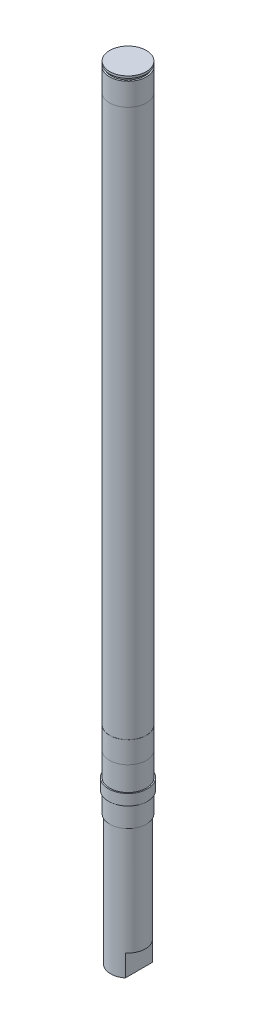
ISO-10303-21;
HEADER;
FILE_DESCRIPTION(('STEP AP214'),'2;1');
FILE_NAME('part.step','',(''),(''),'','','');
FILE_SCHEMA(('AUTOMOTIVE_DESIGN { 1 0 10303 214 1 1 1 1 }'));
ENDSEC;
DATA;
#1=APPLICATION_CONTEXT('core data for automotive mechanical design processes');
#2=APPLICATION_PROTOCOL_DEFINITION('international standard','automotive_design',2000,#1);
#3=PRODUCT_CONTEXT('',#1,'mechanical');
#4=PRODUCT('Part','Part','',(#3));
#5=PRODUCT_RELATED_PRODUCT_CATEGORY('part','',(#4));
#6=PRODUCT_DEFINITION_FORMATION('','',#4);
#7=PRODUCT_DEFINITION_CONTEXT('part definition',#1,'design');
#8=PRODUCT_DEFINITION('design','',#6,#7);
#9=PRODUCT_DEFINITION_SHAPE('','',#8);
#10=(LENGTH_UNIT() NAMED_UNIT(*) SI_UNIT(.MILLI.,.METRE.));
#11=(NAMED_UNIT(*) PLANE_ANGLE_UNIT() SI_UNIT($,.RADIAN.));
#12=(NAMED_UNIT(*) SI_UNIT($,.STERADIAN.) SOLID_ANGLE_UNIT());
#13=UNCERTAINTY_MEASURE_WITH_UNIT(LENGTH_MEASURE(1.E-05),#10,'distance_accuracy_value','');
#14=(GEOMETRIC_REPRESENTATION_CONTEXT(3) GLOBAL_UNCERTAINTY_ASSIGNED_CONTEXT((#13)) GLOBAL_UNIT_ASSIGNED_CONTEXT((#10,
#11,#12)) REPRESENTATION_CONTEXT('',''));
#15=CARTESIAN_POINT('',(0.,0.,0.));
#16=DIRECTION('',(0.,0.,1.));
#17=DIRECTION('',(1.,0.,0.));
#18=AXIS2_PLACEMENT_3D('',#15,#16,#17);
#19=CARTESIAN_POINT('',(0.,0.,0.));
#20=DIRECTION('',(0.,-1.,0.));
#21=DIRECTION('',(1.,0.,0.));
#22=AXIS2_PLACEMENT_3D('',#19,#20,#21);
#23=PLANE('',#22);
#24=CARTESIAN_POINT('',(0.,0.,0.));
#25=DIRECTION('',(0.,-1.,0.));
#26=DIRECTION('',(1.,0.,0.));
#27=AXIS2_PLACEMENT_3D('',#24,#25,#26);
#28=CIRCLE('',#27,8.00000000000001);
#29=CARTESIAN_POINT('',(5.,0.,6.24499799839841));
#30=VERTEX_POINT('',#29);
#31=CARTESIAN_POINT('',(-5.,0.,6.24499799839841));
#32=VERTEX_POINT('',#31);
#33=EDGE_CURVE('E83',#30,#32,#28,.T.);
#34=ORIENTED_EDGE('',*,*,#33,.T.);
#35=DIRECTION('',(0.,0.,-1.));
#36=VECTOR('',#35,1.);
#37=CARTESIAN_POINT('',(-5.,0.,-12.3053779008906));
#38=LINE('',#37,#36);
#39=CARTESIAN_POINT('',(-5.,0.,-6.24499799839841));
#40=VERTEX_POINT('',#39);
#41=EDGE_CURVE('E53',#32,#40,#38,.T.);
#42=ORIENTED_EDGE('',*,*,#41,.T.);
#43=CARTESIAN_POINT('',(5.,0.,-6.24499799839841));
#44=VERTEX_POINT('',#43);
#45=EDGE_CURVE('E85',#40,#44,#28,.T.);
#46=ORIENTED_EDGE('',*,*,#45,.T.);
#47=DIRECTION('',(0.,0.,1.));
#48=VECTOR('',#47,1.);
#49=CARTESIAN_POINT('',(5.,0.,-12.3053779008906));
#50=LINE('',#49,#48);
#51=EDGE_CURVE('E45',#44,#30,#50,.T.);
#52=ORIENTED_EDGE('',*,*,#51,.T.);
#53=EDGE_LOOP('',(#34,#42,#46,#52));
#54=FACE_BOUND('',#53,.T.);
#55=ADVANCED_FACE('F31',(#54),#23,.T.);
#56=CARTESIAN_POINT('',(0.,0.,0.));
#57=DIRECTION('',(0.,-1.,0.));
#58=DIRECTION('',(1.,0.,0.));
#59=AXIS2_PLACEMENT_3D('',#56,#57,#58);
#60=CYLINDRICAL_SURFACE('',#59,8.00000000000001);
#61=CARTESIAN_POINT('',(0.,60.,0.));
#62=DIRECTION('',(0.,-1.,0.));
#63=DIRECTION('',(1.,0.,0.));
#64=AXIS2_PLACEMENT_3D('',#61,#62,#63);
#65=CIRCLE('',#64,8.00000000000002);
#66=CARTESIAN_POINT('',(8.,60.,0.));
#67=VERTEX_POINT('',#66);
#68=EDGE_CURVE('E93',#67,#67,#65,.T.);
#69=ORIENTED_EDGE('',*,*,#68,.T.);
#70=EDGE_LOOP('',(#69));
#71=FACE_BOUND('',#70,.T.);
#72=ORIENTED_EDGE('',*,*,#45,.F.);
#73=DIRECTION('',(0.,-1.,0.));
#74=VECTOR('',#73,1.);
#75=CARTESIAN_POINT('',(-5.,0.,-6.24499799839841));
#76=LINE('',#75,#74);
#77=CARTESIAN_POINT('',(-5.,10.,-6.24499799839841));
#78=VERTEX_POINT('',#77);
#79=EDGE_CURVE('E12',#40,#78,#76,.F.);
#80=ORIENTED_EDGE('',*,*,#79,.T.);
#81=CARTESIAN_POINT('',(0.,10.,0.));
#82=DIRECTION('',(0.,-1.,0.));
#83=DIRECTION('',(0.,0.,-1.));
#84=AXIS2_PLACEMENT_3D('',#81,#82,#83);
#85=CIRCLE('',#84,8.00000000000001);
#86=CARTESIAN_POINT('',(-5.,10.,6.24499799839841));
#87=VERTEX_POINT('',#86);
#88=EDGE_CURVE('E38',#78,#87,#85,.F.);
#89=ORIENTED_EDGE('',*,*,#88,.T.);
#90=DIRECTION('',(0.,-1.,0.));
#91=VECTOR('',#90,1.);
#92=CARTESIAN_POINT('',(-5.,0.,6.24499799839841));
#93=LINE('',#92,#91);
#94=EDGE_CURVE('E77',#87,#32,#93,.T.);
#95=ORIENTED_EDGE('',*,*,#94,.T.);
#96=ORIENTED_EDGE('',*,*,#33,.F.);
#97=DIRECTION('',(0.,-1.,0.));
#98=VECTOR('',#97,1.);
#99=CARTESIAN_POINT('',(5.,0.,6.24499799839841));
#100=LINE('',#99,#98);
#101=CARTESIAN_POINT('',(5.,10.,6.24499799839841));
#102=VERTEX_POINT('',#101);
#103=EDGE_CURVE('E70',#30,#102,#100,.F.);
#104=ORIENTED_EDGE('',*,*,#103,.T.);
#105=CARTESIAN_POINT('',(5.,10.,-6.24499799839841));
#106=VERTEX_POINT('',#105);
#107=EDGE_CURVE('E78',#102,#106,#85,.F.);
#108=ORIENTED_EDGE('',*,*,#107,.T.);
#109=DIRECTION('',(0.,-1.,0.));
#110=VECTOR('',#109,1.);
#111=CARTESIAN_POINT('',(5.,0.,-6.24499799839841));
#112=LINE('',#111,#110);
#113=EDGE_CURVE('E90',#106,#44,#112,.T.);
#114=ORIENTED_EDGE('',*,*,#113,.T.);
#115=EDGE_LOOP('',(#72,#80,#89,#95,#96,#104,#108,#114));
#116=FACE_BOUND('',#115,.T.);
#117=ADVANCED_FACE('F88',(#71,#116),#60,.T.);
#118=CARTESIAN_POINT('',(8.45,60.,0.));
#119=DIRECTION('',(0.,-1.,0.));
#120=DIRECTION('',(1.,0.,0.));
#121=AXIS2_PLACEMENT_3D('',#118,#119,#120);
#122=PLANE('',#121);
#123=CARTESIAN_POINT('',(0.,60.,0.));
#124=DIRECTION('',(0.,-1.,0.));
#125=DIRECTION('',(1.,0.,0.));
#126=AXIS2_PLACEMENT_3D('',#123,#124,#125);
#127=CIRCLE('',#126,8.45000000000001);
#128=CARTESIAN_POINT('',(8.45,60.,0.));
#129=VERTEX_POINT('',#128);
#130=EDGE_CURVE('E150',#129,#129,#127,.T.);
#131=ORIENTED_EDGE('',*,*,#130,.T.);
#132=EDGE_LOOP('',(#131));
#133=FACE_BOUND('',#132,.T.);
#134=ORIENTED_EDGE('',*,*,#68,.F.);
#135=EDGE_LOOP('',(#134));
#136=FACE_BOUND('',#135,.T.);
#137=ADVANCED_FACE('F158',(#133,#136),#122,.T.);
#138=CARTESIAN_POINT('',(0.,0.,0.));
#139=DIRECTION('',(0.,-1.,0.));
#140=DIRECTION('',(1.,0.,0.));
#141=AXIS2_PLACEMENT_3D('',#138,#139,#140);
#142=CYLINDRICAL_SURFACE('',#141,8.45000000000002);
#143=CARTESIAN_POINT('',(0.,69.4,0.));
#144=DIRECTION('',(0.,-1.,0.));
#145=DIRECTION('',(1.,0.,0.));
#146=AXIS2_PLACEMENT_3D('',#143,#144,#145);
#147=CIRCLE('',#146,8.45000000000002);
#148=CARTESIAN_POINT('',(8.45,69.4,0.));
#149=VERTEX_POINT('',#148);
#150=EDGE_CURVE('E148',#149,#149,#147,.T.);
#151=ORIENTED_EDGE('',*,*,#150,.T.);
#152=EDGE_LOOP('',(#151));
#153=FACE_BOUND('',#152,.T.);
#154=ORIENTED_EDGE('',*,*,#130,.F.);
#155=EDGE_LOOP('',(#154));
#156=FACE_BOUND('',#155,.T.);
#157=ADVANCED_FACE('F160',(#153,#156),#142,.T.);
#158=CARTESIAN_POINT('',(8.45,69.4,0.));
#159=DIRECTION('',(0.,-1.,0.));
#160=DIRECTION('',(1.,0.,0.));
#161=AXIS2_PLACEMENT_3D('',#158,#159,#160);
#162=PLANE('',#161);
#163=CARTESIAN_POINT('',(0.,69.4,0.));
#164=DIRECTION('',(0.,-1.,0.));
#165=DIRECTION('',(1.,0.,0.));
#166=AXIS2_PLACEMENT_3D('',#163,#164,#165);
#167=CIRCLE('',#166,9.);
#168=CARTESIAN_POINT('',(8.99999999999998,69.4,0.));
#169=VERTEX_POINT('',#168);
#170=EDGE_CURVE('E145',#169,#169,#167,.T.);
#171=ORIENTED_EDGE('',*,*,#170,.T.);
#172=EDGE_LOOP('',(#171));
#173=FACE_BOUND('',#172,.T.);
#174=ORIENTED_EDGE('',*,*,#150,.F.);
#175=EDGE_LOOP('',(#174));
#176=FACE_BOUND('',#175,.T.);
#177=ADVANCED_FACE('F166',(#173,#176),#162,.T.);
#178=CARTESIAN_POINT('',(0.,0.,0.));
#179=DIRECTION('',(0.,-1.,0.));
#180=DIRECTION('',(1.,0.,0.));
#181=AXIS2_PLACEMENT_3D('',#178,#179,#180);
#182=CYLINDRICAL_SURFACE('',#181,9.);
#183=CARTESIAN_POINT('',(0.,74.4,0.));
#184=DIRECTION('',(0.,-1.,0.));
#185=DIRECTION('',(1.,0.,0.));
#186=AXIS2_PLACEMENT_3D('',#183,#184,#185);
#187=CIRCLE('',#186,9.);
#188=CARTESIAN_POINT('',(8.99999999999998,74.4,0.));
#189=VERTEX_POINT('',#188);
#190=EDGE_CURVE('E142',#189,#189,#187,.T.);
#191=ORIENTED_EDGE('',*,*,#190,.T.);
#192=EDGE_LOOP('',(#191));
#193=FACE_BOUND('',#192,.T.);
#194=ORIENTED_EDGE('',*,*,#170,.F.);
#195=EDGE_LOOP('',(#194));
#196=FACE_BOUND('',#195,.T.);
#197=ADVANCED_FACE('F267',(#193,#196),#182,.T.);
#198=CARTESIAN_POINT('',(8.45,74.4,0.));
#199=DIRECTION('',(0.,1.,0.));
#200=DIRECTION('',(-1.,0.,0.));
#201=AXIS2_PLACEMENT_3D('',#198,#199,#200);
#202=PLANE('',#201);
#203=CARTESIAN_POINT('',(0.,74.4,0.));
#204=DIRECTION('',(0.,-1.,0.));
#205=DIRECTION('',(1.,0.,0.));
#206=AXIS2_PLACEMENT_3D('',#203,#204,#205);
#207=CIRCLE('',#206,8.45000000000002);
#208=CARTESIAN_POINT('',(8.45,74.4,0.));
#209=VERTEX_POINT('',#208);
#210=EDGE_CURVE('E139',#209,#209,#207,.T.);
#211=ORIENTED_EDGE('',*,*,#210,.T.);
#212=EDGE_LOOP('',(#211));
#213=FACE_BOUND('',#212,.T.);
#214=ORIENTED_EDGE('',*,*,#190,.F.);
#215=EDGE_LOOP('',(#214));
#216=FACE_BOUND('',#215,.T.);
#217=ADVANCED_FACE('F263',(#213,#216),#202,.T.);
#218=CARTESIAN_POINT('',(0.,0.,0.));
#219=DIRECTION('',(0.,-1.,0.));
#220=DIRECTION('',(1.,0.,0.));
#221=AXIS2_PLACEMENT_3D('',#218,#219,#220);
#222=CYLINDRICAL_SURFACE('',#221,8.45000000000001);
#223=CARTESIAN_POINT('',(0.,85.5,0.));
#224=DIRECTION('',(0.,-1.,0.));
#225=DIRECTION('',(1.,0.,0.));
#226=AXIS2_PLACEMENT_3D('',#223,#224,#225);
#227=CIRCLE('',#226,8.45);
#228=CARTESIAN_POINT('',(8.44999999999998,85.5,0.));
#229=VERTEX_POINT('',#228);
#230=EDGE_CURVE('E136',#229,#229,#227,.T.);
#231=ORIENTED_EDGE('',*,*,#230,.T.);
#232=EDGE_LOOP('',(#231));
#233=FACE_BOUND('',#232,.T.);
#234=ORIENTED_EDGE('',*,*,#210,.F.);
#235=EDGE_LOOP('',(#234));
#236=FACE_BOUND('',#235,.T.);
#237=ADVANCED_FACE('F259',(#233,#236),#222,.T.);
#238=CARTESIAN_POINT('',(8.44999999999998,85.5,0.));
#239=DIRECTION('',(0.,-1.,0.));
#240=DIRECTION('',(1.,0.,0.));
#241=AXIS2_PLACEMENT_3D('',#238,#239,#240);
#242=PLANE('',#241);
#243=CARTESIAN_POINT('',(0.,85.5,0.));
#244=DIRECTION('',(0.,-1.,0.));
#245=DIRECTION('',(1.,0.,0.));
#246=AXIS2_PLACEMENT_3D('',#243,#244,#245);
#247=CIRCLE('',#246,8.5);
#248=CARTESIAN_POINT('',(8.49999999999998,85.5,0.));
#249=VERTEX_POINT('',#248);
#250=EDGE_CURVE('E133',#249,#249,#247,.T.);
#251=ORIENTED_EDGE('',*,*,#250,.T.);
#252=EDGE_LOOP('',(#251));
#253=FACE_BOUND('',#252,.T.);
#254=ORIENTED_EDGE('',*,*,#230,.F.);
#255=EDGE_LOOP('',(#254));
#256=FACE_BOUND('',#255,.T.);
#257=ADVANCED_FACE('F255',(#253,#256),#242,.T.);
#258=CARTESIAN_POINT('',(0.,0.,0.));
#259=DIRECTION('',(0.,-1.,0.));
#260=DIRECTION('',(1.,0.,0.));
#261=AXIS2_PLACEMENT_3D('',#258,#259,#260);
#262=CYLINDRICAL_SURFACE('',#261,8.5);
#263=CARTESIAN_POINT('',(0.,95.5,0.));
#264=DIRECTION('',(0.,-1.,0.));
#265=DIRECTION('',(1.,0.,0.));
#266=AXIS2_PLACEMENT_3D('',#263,#264,#265);
#267=CIRCLE('',#266,8.5);
#268=CARTESIAN_POINT('',(8.49999999999998,95.5,0.));
#269=VERTEX_POINT('',#268);
#270=EDGE_CURVE('E130',#269,#269,#267,.T.);
#271=ORIENTED_EDGE('',*,*,#270,.T.);
#272=EDGE_LOOP('',(#271));
#273=FACE_BOUND('',#272,.T.);
#274=ORIENTED_EDGE('',*,*,#250,.F.);
#275=EDGE_LOOP('',(#274));
#276=FACE_BOUND('',#275,.T.);
#277=ADVANCED_FACE('F251',(#273,#276),#262,.T.);
#278=CARTESIAN_POINT('',(8.49999999999998,95.5,0.));
#279=DIRECTION('',(0.,1.,0.));
#280=DIRECTION('',(-1.,0.,0.));
#281=AXIS2_PLACEMENT_3D('',#278,#279,#280);
#282=PLANE('',#281);
#283=CARTESIAN_POINT('',(0.,95.5,0.));
#284=DIRECTION('',(0.,-1.,0.));
#285=DIRECTION('',(1.,0.,0.));
#286=AXIS2_PLACEMENT_3D('',#283,#284,#285);
#287=CIRCLE('',#286,8.45);
#288=CARTESIAN_POINT('',(8.44999999999997,95.5,0.));
#289=VERTEX_POINT('',#288);
#290=EDGE_CURVE('E127',#289,#289,#287,.T.);
#291=ORIENTED_EDGE('',*,*,#290,.T.);
#292=EDGE_LOOP('',(#291));
#293=FACE_BOUND('',#292,.T.);
#294=ORIENTED_EDGE('',*,*,#270,.F.);
#295=EDGE_LOOP('',(#294));
#296=FACE_BOUND('',#295,.T.);
#297=ADVANCED_FACE('F247',(#293,#296),#282,.T.);
#298=CARTESIAN_POINT('',(0.,0.,0.));
#299=DIRECTION('',(0.,-1.,0.));
#300=DIRECTION('',(1.,0.,0.));
#301=AXIS2_PLACEMENT_3D('',#298,#299,#300);
#302=CYLINDRICAL_SURFACE('',#301,8.45000000000003);
#303=CARTESIAN_POINT('',(0.,348.,0.));
#304=DIRECTION('',(0.,-1.,0.));
#305=DIRECTION('',(1.,0.,0.));
#306=AXIS2_PLACEMENT_3D('',#303,#304,#305);
#307=CIRCLE('',#306,8.45000000000006);
#308=CARTESIAN_POINT('',(8.44999999999997,348.,0.));
#309=VERTEX_POINT('',#308);
#310=EDGE_CURVE('E124',#309,#309,#307,.T.);
#311=ORIENTED_EDGE('',*,*,#310,.T.);
#312=EDGE_LOOP('',(#311));
#313=FACE_BOUND('',#312,.T.);
#314=ORIENTED_EDGE('',*,*,#290,.F.);
#315=EDGE_LOOP('',(#314));
#316=FACE_BOUND('',#315,.T.);
#317=ADVANCED_FACE('F243',(#313,#316),#302,.T.);
#318=CARTESIAN_POINT('',(8.44999999999997,348.,0.));
#319=DIRECTION('',(0.,-1.,0.));
#320=DIRECTION('',(1.,0.,0.));
#321=AXIS2_PLACEMENT_3D('',#318,#319,#320);
#322=PLANE('',#321);
#323=CARTESIAN_POINT('',(0.,348.,0.));
#324=DIRECTION('',(0.,-1.,0.));
#325=DIRECTION('',(1.,0.,0.));
#326=AXIS2_PLACEMENT_3D('',#323,#324,#325);
#327=CIRCLE('',#326,8.5);
#328=CARTESIAN_POINT('',(8.49999999999991,348.,0.));
#329=VERTEX_POINT('',#328);
#330=EDGE_CURVE('E121',#329,#329,#327,.T.);
#331=ORIENTED_EDGE('',*,*,#330,.T.);
#332=EDGE_LOOP('',(#331));
#333=FACE_BOUND('',#332,.T.);
#334=ORIENTED_EDGE('',*,*,#310,.F.);
#335=EDGE_LOOP('',(#334));
#336=FACE_BOUND('',#335,.T.);
#337=ADVANCED_FACE('F239',(#333,#336),#322,.T.);
#338=CARTESIAN_POINT('',(0.,0.,0.));
#339=DIRECTION('',(0.,-1.,0.));
#340=DIRECTION('',(1.,0.,0.));
#341=AXIS2_PLACEMENT_3D('',#338,#339,#340);
#342=CYLINDRICAL_SURFACE('',#341,8.5);
#343=CARTESIAN_POINT('',(0.,358.4,0.));
#344=DIRECTION('',(0.,-1.,0.));
#345=DIRECTION('',(1.,0.,0.));
#346=AXIS2_PLACEMENT_3D('',#343,#344,#345);
#347=CIRCLE('',#346,8.5);
#348=CARTESIAN_POINT('',(8.49999999999991,358.4,0.));
#349=VERTEX_POINT('',#348);
#350=EDGE_CURVE('E118',#349,#349,#347,.T.);
#351=ORIENTED_EDGE('',*,*,#350,.T.);
#352=EDGE_LOOP('',(#351));
#353=FACE_BOUND('',#352,.T.);
#354=ORIENTED_EDGE('',*,*,#330,.F.);
#355=EDGE_LOOP('',(#354));
#356=FACE_BOUND('',#355,.T.);
#357=ADVANCED_FACE('F235',(#353,#356),#342,.T.);
#358=CARTESIAN_POINT('',(8.49999999999991,358.4,0.));
#359=DIRECTION('',(0.,1.,0.));
#360=DIRECTION('',(-1.,0.,0.));
#361=AXIS2_PLACEMENT_3D('',#358,#359,#360);
#362=PLANE('',#361);
#363=CARTESIAN_POINT('',(0.,358.4,0.));
#364=DIRECTION('',(0.,-1.,0.));
#365=DIRECTION('',(1.,0.,0.));
#366=AXIS2_PLACEMENT_3D('',#363,#364,#365);
#367=CIRCLE('',#366,7.75);
#368=CARTESIAN_POINT('',(7.74999999999991,358.4,0.));
#369=VERTEX_POINT('',#368);
#370=EDGE_CURVE('E115',#369,#369,#367,.T.);
#371=ORIENTED_EDGE('',*,*,#370,.T.);
#372=EDGE_LOOP('',(#371));
#373=FACE_BOUND('',#372,.T.);
#374=ORIENTED_EDGE('',*,*,#350,.F.);
#375=EDGE_LOOP('',(#374));
#376=FACE_BOUND('',#375,.T.);
#377=ADVANCED_FACE('F231',(#373,#376),#362,.T.);
#378=CARTESIAN_POINT('',(0.,0.,0.));
#379=DIRECTION('',(0.,-1.,0.));
#380=DIRECTION('',(1.,0.,0.));
#381=AXIS2_PLACEMENT_3D('',#378,#379,#380);
#382=CYLINDRICAL_SURFACE('',#381,7.75);
#383=CARTESIAN_POINT('',(0.,359.5,0.));
#384=DIRECTION('',(0.,-1.,0.));
#385=DIRECTION('',(1.,0.,0.));
#386=AXIS2_PLACEMENT_3D('',#383,#384,#385);
#387=CIRCLE('',#386,7.75);
#388=CARTESIAN_POINT('',(7.74999999999991,359.5,0.));
#389=VERTEX_POINT('',#388);
#390=EDGE_CURVE('E112',#389,#389,#387,.T.);
#391=ORIENTED_EDGE('',*,*,#390,.T.);
#392=EDGE_LOOP('',(#391));
#393=FACE_BOUND('',#392,.T.);
#394=ORIENTED_EDGE('',*,*,#370,.F.);
#395=EDGE_LOOP('',(#394));
#396=FACE_BOUND('',#395,.T.);
#397=ADVANCED_FACE('F227',(#393,#396),#382,.T.);
#398=CARTESIAN_POINT('',(8.44999999999997,359.5,0.));
#399=DIRECTION('',(0.,-1.,0.));
#400=DIRECTION('',(1.,0.,0.));
#401=AXIS2_PLACEMENT_3D('',#398,#399,#400);
#402=PLANE('',#401);
#403=CARTESIAN_POINT('',(0.,359.5,0.));
#404=DIRECTION('',(0.,-1.,0.));
#405=DIRECTION('',(1.,0.,0.));
#406=AXIS2_PLACEMENT_3D('',#403,#404,#405);
#407=CIRCLE('',#406,8.45000000000006);
#408=CARTESIAN_POINT('',(8.44999999999997,359.5,0.));
#409=VERTEX_POINT('',#408);
#410=EDGE_CURVE('E109',#409,#409,#407,.T.);
#411=ORIENTED_EDGE('',*,*,#410,.T.);
#412=EDGE_LOOP('',(#411));
#413=FACE_BOUND('',#412,.T.);
#414=ORIENTED_EDGE('',*,*,#390,.F.);
#415=EDGE_LOOP('',(#414));
#416=FACE_BOUND('',#415,.T.);
#417=ADVANCED_FACE('F223',(#413,#416),#402,.T.);
#418=CARTESIAN_POINT('',(0.,0.,0.));
#419=DIRECTION('',(0.,-1.,0.));
#420=DIRECTION('',(1.,0.,0.));
#421=AXIS2_PLACEMENT_3D('',#418,#419,#420);
#422=CYLINDRICAL_SURFACE('',#421,8.45000000000006);
#423=CARTESIAN_POINT('',(0.,360.5,0.));
#424=DIRECTION('',(0.,-1.,0.));
#425=DIRECTION('',(1.,0.,0.));
#426=AXIS2_PLACEMENT_3D('',#423,#424,#425);
#427=CIRCLE('',#426,8.45000000000006);
#428=CARTESIAN_POINT('',(8.44999999999997,360.5,0.));
#429=VERTEX_POINT('',#428);
#430=EDGE_CURVE('E103',#429,#429,#427,.T.);
#431=ORIENTED_EDGE('',*,*,#430,.T.);
#432=EDGE_LOOP('',(#431));
#433=FACE_BOUND('',#432,.T.);
#434=ORIENTED_EDGE('',*,*,#410,.F.);
#435=EDGE_LOOP('',(#434));
#436=FACE_BOUND('',#435,.T.);
#437=ADVANCED_FACE('F219',(#433,#436),#422,.T.);
#438=CARTESIAN_POINT('',(8.44999999999997,360.5,0.));
#439=DIRECTION('',(0.,1.,0.));
#440=DIRECTION('',(-1.,0.,0.));
#441=AXIS2_PLACEMENT_3D('',#438,#439,#440);
#442=PLANE('',#441);
#443=ORIENTED_EDGE('',*,*,#430,.F.);
#444=EDGE_LOOP('',(#443));
#445=FACE_BOUND('',#444,.T.);
#446=ADVANCED_FACE('F188',(#445),#442,.T.);
#447=CARTESIAN_POINT('',(5.,10.,-12.3053779008906));
#448=DIRECTION('',(1.,0.,0.));
#449=DIRECTION('',(0.,0.,-1.));
#450=AXIS2_PLACEMENT_3D('',#447,#448,#449);
#451=PLANE('',#450);
#452=ORIENTED_EDGE('',*,*,#51,.F.);
#453=ORIENTED_EDGE('',*,*,#113,.F.);
#454=DIRECTION('',(0.,0.,1.));
#455=VECTOR('',#454,1.);
#456=CARTESIAN_POINT('',(5.,10.,-12.3053779008906));
#457=LINE('',#456,#455);
#458=EDGE_CURVE('E73',#106,#102,#457,.T.);
#459=ORIENTED_EDGE('',*,*,#458,.T.);
#460=ORIENTED_EDGE('',*,*,#103,.F.);
#461=EDGE_LOOP('',(#452,#453,#459,#460));
#462=FACE_BOUND('',#461,.T.);
#463=ADVANCED_FACE('F71',(#462),#451,.T.);
#464=CARTESIAN_POINT('',(0.,10.,0.));
#465=DIRECTION('',(0.,-1.,0.));
#466=DIRECTION('',(0.,0.,-1.));
#467=AXIS2_PLACEMENT_3D('',#464,#465,#466);
#468=PLANE('',#467);
#469=ORIENTED_EDGE('',*,*,#458,.F.);
#470=ORIENTED_EDGE('',*,*,#107,.F.);
#471=EDGE_LOOP('',(#469,#470));
#472=FACE_BOUND('',#471,.T.);
#473=ADVANCED_FACE('F187',(#472),#468,.T.);
#474=DIRECTION('',(0.,0.,-1.));
#475=VECTOR('',#474,1.);
#476=CARTESIAN_POINT('',(-5.,10.,-12.3053779008906));
#477=LINE('',#476,#475);
#478=EDGE_CURVE('E86',#87,#78,#477,.T.);
#479=ORIENTED_EDGE('',*,*,#478,.F.);
#480=ORIENTED_EDGE('',*,*,#88,.F.);
#481=EDGE_LOOP('',(#479,#480));
#482=FACE_BOUND('',#481,.T.);
#483=ADVANCED_FACE('F100',(#482),#468,.T.);
#484=CARTESIAN_POINT('',(-5.,10.,-12.3053779008906));
#485=DIRECTION('',(-1.,0.,0.));
#486=DIRECTION('',(0.,0.,1.));
#487=AXIS2_PLACEMENT_3D('',#484,#485,#486);
#488=PLANE('',#487);
#489=ORIENTED_EDGE('',*,*,#41,.F.);
#490=ORIENTED_EDGE('',*,*,#94,.F.);
#491=ORIENTED_EDGE('',*,*,#478,.T.);
#492=ORIENTED_EDGE('',*,*,#79,.F.);
#493=EDGE_LOOP('',(#489,#490,#491,#492));
#494=FACE_BOUND('',#493,.T.);
#495=ADVANCED_FACE('F101',(#494),#488,.T.);
#496=CLOSED_SHELL('',(#55,#117,#137,#157,#177,#197,#217,#237,#257,#277,#297,#317,#337,#357,#377,
#397,#417,#437,#446,#463,#473,#483,#495));
#497=MANIFOLD_SOLID_BREP('B2',#496);
#498=ADVANCED_BREP_SHAPE_REPRESENTATION('',(#18,#497),#14);
#499=SHAPE_DEFINITION_REPRESENTATION(#9,#498);
ENDSEC;
END-ISO-10303-21;
